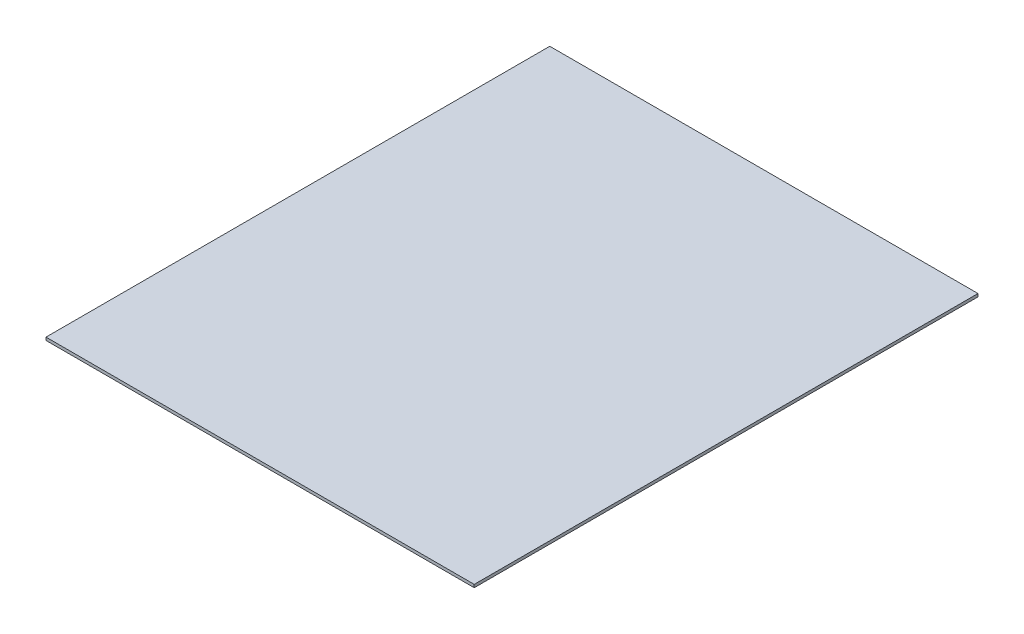
ISO-10303-21;
HEADER;
FILE_DESCRIPTION(('STEP AP214'),'2;1');
FILE_NAME('part.step','',(''),(''),'','','');
FILE_SCHEMA(('AUTOMOTIVE_DESIGN { 1 0 10303 214 1 1 1 1 }'));
ENDSEC;
DATA;
#1=APPLICATION_CONTEXT('core data for automotive mechanical design processes');
#2=APPLICATION_PROTOCOL_DEFINITION('international standard','automotive_design',2000,#1);
#3=PRODUCT_CONTEXT('',#1,'mechanical');
#4=PRODUCT('Part','Part','',(#3));
#5=PRODUCT_RELATED_PRODUCT_CATEGORY('part','',(#4));
#6=PRODUCT_DEFINITION_FORMATION('','',#4);
#7=PRODUCT_DEFINITION_CONTEXT('part definition',#1,'design');
#8=PRODUCT_DEFINITION('design','',#6,#7);
#9=PRODUCT_DEFINITION_SHAPE('','',#8);
#10=(LENGTH_UNIT() NAMED_UNIT(*) SI_UNIT(.MILLI.,.METRE.));
#11=(NAMED_UNIT(*) PLANE_ANGLE_UNIT() SI_UNIT($,.RADIAN.));
#12=(NAMED_UNIT(*) SI_UNIT($,.STERADIAN.) SOLID_ANGLE_UNIT());
#13=UNCERTAINTY_MEASURE_WITH_UNIT(LENGTH_MEASURE(1.E-05),#10,'distance_accuracy_value','');
#14=(GEOMETRIC_REPRESENTATION_CONTEXT(3) GLOBAL_UNCERTAINTY_ASSIGNED_CONTEXT((#13)) GLOBAL_UNIT_ASSIGNED_CONTEXT((#10,
#11,#12)) REPRESENTATION_CONTEXT('',''));
#15=CARTESIAN_POINT('',(0.,0.,0.));
#16=DIRECTION('',(0.,0.,1.));
#17=DIRECTION('',(1.,0.,0.));
#18=AXIS2_PLACEMENT_3D('',#15,#16,#17);
#19=CARTESIAN_POINT('',(180.400934579439,2.,-133.597819314642));
#20=DIRECTION('',(0.,0.,1.));
#21=DIRECTION('',(1.,0.,0.));
#22=AXIS2_PLACEMENT_3D('',#19,#20,#21);
#23=PLANE('',#22);
#24=DIRECTION('',(-1.,0.,0.));
#25=VECTOR('',#24,1.);
#26=CARTESIAN_POINT('',(180.400934579439,0.,-133.597819314642));
#27=LINE('',#26,#25);
#28=CARTESIAN_POINT('',(180.400934579439,0.,-133.597819314642));
#29=VERTEX_POINT('',#28);
#30=CARTESIAN_POINT('',(-111.599065420561,0.,-133.597819314642));
#31=VERTEX_POINT('',#30);
#32=EDGE_CURVE('E84',#29,#31,#27,.T.);
#33=ORIENTED_EDGE('',*,*,#32,.T.);
#34=DIRECTION('',(0.,-1.,0.));
#35=VECTOR('',#34,1.);
#36=CARTESIAN_POINT('',(-111.599065420561,2.,-133.597819314642));
#37=LINE('',#36,#35);
#38=CARTESIAN_POINT('',(-111.599065420561,2.,-133.597819314642));
#39=VERTEX_POINT('',#38);
#40=EDGE_CURVE('E11',#39,#31,#37,.T.);
#41=ORIENTED_EDGE('',*,*,#40,.F.);
#42=DIRECTION('',(-1.,0.,0.));
#43=VECTOR('',#42,1.);
#44=CARTESIAN_POINT('',(180.400934579439,2.,-133.597819314642));
#45=LINE('',#44,#43);
#46=CARTESIAN_POINT('',(180.400934579439,2.,-133.597819314642));
#47=VERTEX_POINT('',#46);
#48=EDGE_CURVE('E78',#47,#39,#45,.T.);
#49=ORIENTED_EDGE('',*,*,#48,.F.);
#50=DIRECTION('',(0.,-1.,0.));
#51=VECTOR('',#50,1.);
#52=CARTESIAN_POINT('',(180.400934579439,2.,-133.597819314642));
#53=LINE('',#52,#51);
#54=EDGE_CURVE('E40',#47,#29,#53,.T.);
#55=ORIENTED_EDGE('',*,*,#54,.T.);
#56=EDGE_LOOP('',(#33,#41,#49,#55));
#57=FACE_BOUND('',#56,.T.);
#58=ADVANCED_FACE('F33',(#57),#23,.F.);
#59=CARTESIAN_POINT('',(-111.599065420561,2.,-133.597819314642));
#60=DIRECTION('',(1.,0.,0.));
#61=DIRECTION('',(0.,0.,-1.));
#62=AXIS2_PLACEMENT_3D('',#59,#60,#61);
#63=PLANE('',#62);
#64=DIRECTION('',(0.,0.,1.));
#65=VECTOR('',#64,1.);
#66=CARTESIAN_POINT('',(-111.599065420561,0.,-133.597819314642));
#67=LINE('',#66,#65);
#68=CARTESIAN_POINT('',(-111.599065420561,0.,209.902180685358));
#69=VERTEX_POINT('',#68);
#70=EDGE_CURVE('E79',#31,#69,#67,.T.);
#71=ORIENTED_EDGE('',*,*,#70,.T.);
#72=DIRECTION('',(0.,1.,0.));
#73=VECTOR('',#72,1.);
#74=CARTESIAN_POINT('',(-111.599065420561,0.,209.902180685358));
#75=LINE('',#74,#73);
#76=CARTESIAN_POINT('',(-111.599065420561,2.,209.902180685358));
#77=VERTEX_POINT('',#76);
#78=EDGE_CURVE('E47',#69,#77,#75,.T.);
#79=ORIENTED_EDGE('',*,*,#78,.T.);
#80=DIRECTION('',(0.,0.,1.));
#81=VECTOR('',#80,1.);
#82=CARTESIAN_POINT('',(-111.599065420561,2.,-133.597819314642));
#83=LINE('',#82,#81);
#84=EDGE_CURVE('E92',#39,#77,#83,.T.);
#85=ORIENTED_EDGE('',*,*,#84,.F.);
#86=ORIENTED_EDGE('',*,*,#40,.T.);
#87=EDGE_LOOP('',(#71,#79,#85,#86));
#88=FACE_BOUND('',#87,.T.);
#89=ADVANCED_FACE('F101',(#88),#63,.F.);
#90=CARTESIAN_POINT('',(180.400934579439,2.,238.402180685358));
#91=DIRECTION('',(-1.,0.,0.));
#92=DIRECTION('',(0.,0.,1.));
#93=AXIS2_PLACEMENT_3D('',#90,#91,#92);
#94=PLANE('',#93);
#95=DIRECTION('',(0.,0.,-1.));
#96=VECTOR('',#95,1.);
#97=CARTESIAN_POINT('',(180.400934579439,2.,238.402180685358));
#98=LINE('',#97,#96);
#99=CARTESIAN_POINT('',(180.400934579439,2.,209.902180685358));
#100=VERTEX_POINT('',#99);
#101=EDGE_CURVE('E56',#100,#47,#98,.T.);
#102=ORIENTED_EDGE('',*,*,#101,.F.);
#103=DIRECTION('',(0.,1.,0.));
#104=VECTOR('',#103,1.);
#105=CARTESIAN_POINT('',(180.400934579439,0.,209.902180685358));
#106=LINE('',#105,#104);
#107=CARTESIAN_POINT('',(180.400934579439,0.,209.902180685358));
#108=VERTEX_POINT('',#107);
#109=EDGE_CURVE('E75',#108,#100,#106,.T.);
#110=ORIENTED_EDGE('',*,*,#109,.F.);
#111=DIRECTION('',(0.,0.,-1.));
#112=VECTOR('',#111,1.);
#113=CARTESIAN_POINT('',(180.400934579439,0.,238.402180685358));
#114=LINE('',#113,#112);
#115=EDGE_CURVE('E70',#108,#29,#114,.T.);
#116=ORIENTED_EDGE('',*,*,#115,.T.);
#117=ORIENTED_EDGE('',*,*,#54,.F.);
#118=EDGE_LOOP('',(#102,#110,#116,#117));
#119=FACE_BOUND('',#118,.T.);
#120=ADVANCED_FACE('F72',(#119),#94,.F.);
#121=CARTESIAN_POINT('',(0.,2.,0.));
#122=DIRECTION('',(0.,1.,0.));
#123=DIRECTION('',(0.,0.,1.));
#124=AXIS2_PLACEMENT_3D('',#121,#122,#123);
#125=PLANE('',#124);
#126=DIRECTION('',(-1.,0.,0.));
#127=VECTOR('',#126,1.);
#128=CARTESIAN_POINT('',(-111.599065420561,2.,209.902180685358));
#129=LINE('',#128,#127);
#130=EDGE_CURVE('E98',#100,#77,#129,.T.);
#131=ORIENTED_EDGE('',*,*,#130,.F.);
#132=ORIENTED_EDGE('',*,*,#101,.T.);
#133=ORIENTED_EDGE('',*,*,#48,.T.);
#134=ORIENTED_EDGE('',*,*,#84,.T.);
#135=EDGE_LOOP('',(#131,#132,#133,#134));
#136=FACE_BOUND('',#135,.T.);
#137=ADVANCED_FACE('F103',(#136),#125,.T.);
#138=CARTESIAN_POINT('',(0.,0.,0.));
#139=DIRECTION('',(0.,1.,0.));
#140=DIRECTION('',(0.,0.,1.));
#141=AXIS2_PLACEMENT_3D('',#138,#139,#140);
#142=PLANE('',#141);
#143=ORIENTED_EDGE('',*,*,#115,.F.);
#144=DIRECTION('',(-1.,0.,0.));
#145=VECTOR('',#144,1.);
#146=CARTESIAN_POINT('',(-111.599065420561,0.,209.902180685358));
#147=LINE('',#146,#145);
#148=EDGE_CURVE('E96',#108,#69,#147,.T.);
#149=ORIENTED_EDGE('',*,*,#148,.T.);
#150=ORIENTED_EDGE('',*,*,#70,.F.);
#151=ORIENTED_EDGE('',*,*,#32,.F.);
#152=EDGE_LOOP('',(#143,#149,#150,#151));
#153=FACE_BOUND('',#152,.T.);
#154=ADVANCED_FACE('F85',(#153),#142,.F.);
#155=CARTESIAN_POINT('',(-111.599065420561,0.,209.902180685358));
#156=DIRECTION('',(0.,0.,-1.));
#157=DIRECTION('',(-1.,0.,0.));
#158=AXIS2_PLACEMENT_3D('',#155,#156,#157);
#159=PLANE('',#158);
#160=ORIENTED_EDGE('',*,*,#130,.T.);
#161=ORIENTED_EDGE('',*,*,#78,.F.);
#162=ORIENTED_EDGE('',*,*,#148,.F.);
#163=ORIENTED_EDGE('',*,*,#109,.T.);
#164=EDGE_LOOP('',(#160,#161,#162,#163));
#165=FACE_BOUND('',#164,.T.);
#166=ADVANCED_FACE('F111',(#165),#159,.F.);
#167=CLOSED_SHELL('',(#58,#89,#120,#137,#154,#166));
#168=MANIFOLD_SOLID_BREP('B2',#167);
#169=ADVANCED_BREP_SHAPE_REPRESENTATION('',(#18,#168),#14);
#170=SHAPE_DEFINITION_REPRESENTATION(#9,#169);
ENDSEC;
END-ISO-10303-21;
